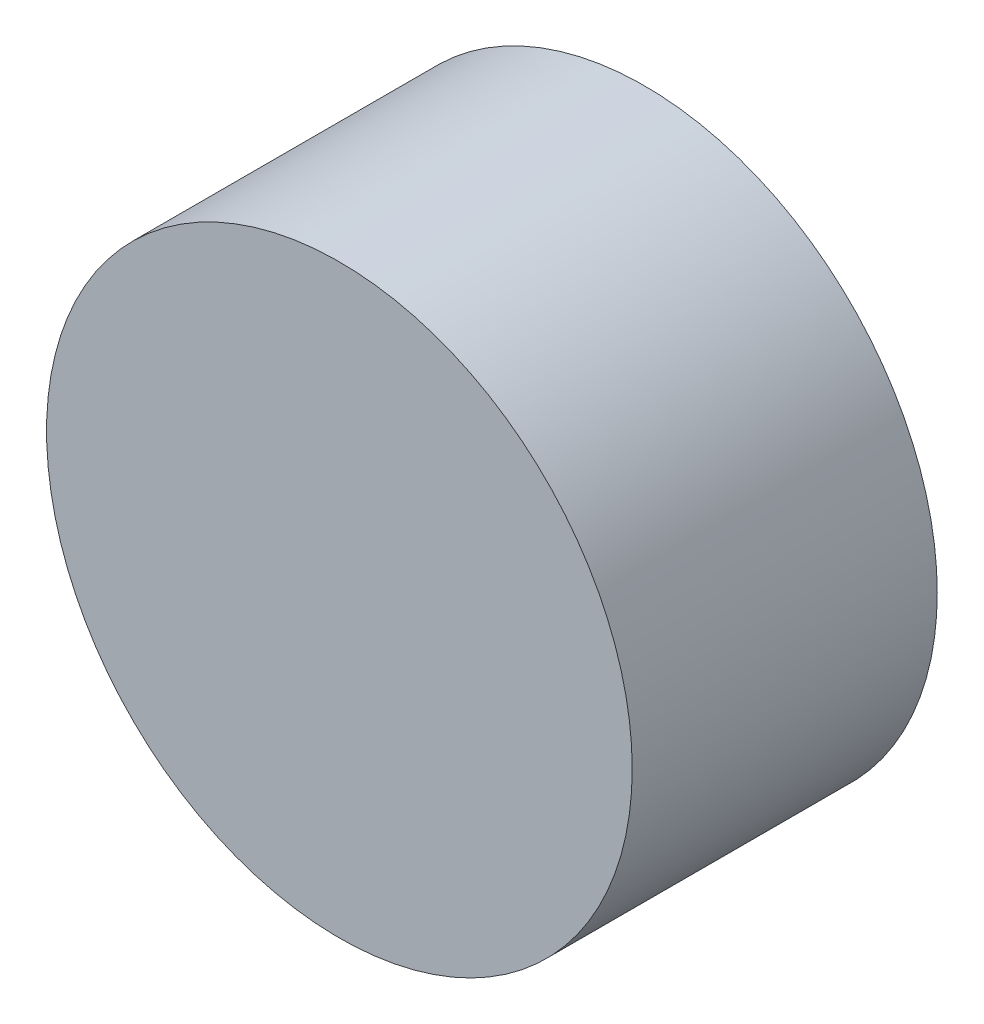
ISO-10303-21;
HEADER;
FILE_DESCRIPTION(('STEP AP214'),'2;1');
FILE_NAME('part.step','',(''),(''),'','','');
FILE_SCHEMA(('AUTOMOTIVE_DESIGN { 1 0 10303 214 1 1 1 1 }'));
ENDSEC;
DATA;
#1=APPLICATION_CONTEXT('core data for automotive mechanical design processes');
#2=APPLICATION_PROTOCOL_DEFINITION('international standard','automotive_design',2000,#1);
#3=PRODUCT_CONTEXT('',#1,'mechanical');
#4=PRODUCT('Part','Part','',(#3));
#5=PRODUCT_RELATED_PRODUCT_CATEGORY('part','',(#4));
#6=PRODUCT_DEFINITION_FORMATION('','',#4);
#7=PRODUCT_DEFINITION_CONTEXT('part definition',#1,'design');
#8=PRODUCT_DEFINITION('design','',#6,#7);
#9=PRODUCT_DEFINITION_SHAPE('','',#8);
#10=(LENGTH_UNIT() NAMED_UNIT(*) SI_UNIT(.MILLI.,.METRE.));
#11=(NAMED_UNIT(*) PLANE_ANGLE_UNIT() SI_UNIT($,.RADIAN.));
#12=(NAMED_UNIT(*) SI_UNIT($,.STERADIAN.) SOLID_ANGLE_UNIT());
#13=UNCERTAINTY_MEASURE_WITH_UNIT(LENGTH_MEASURE(1.E-05),#10,'distance_accuracy_value','');
#14=(GEOMETRIC_REPRESENTATION_CONTEXT(3) GLOBAL_UNCERTAINTY_ASSIGNED_CONTEXT((#13)) GLOBAL_UNIT_ASSIGNED_CONTEXT((#10,
#11,#12)) REPRESENTATION_CONTEXT('',''));
#15=CARTESIAN_POINT('',(0.,0.,0.));
#16=DIRECTION('',(0.,0.,1.));
#17=DIRECTION('',(1.,0.,0.));
#18=AXIS2_PLACEMENT_3D('',#15,#16,#17);
#19=CARTESIAN_POINT('',(0.,0.,25.));
#20=DIRECTION('',(0.,0.,-1.));
#21=DIRECTION('',(-1.,0.,0.));
#22=AXIS2_PLACEMENT_3D('',#19,#20,#21);
#23=CYLINDRICAL_SURFACE('',#22,24.);
#24=CARTESIAN_POINT('',(0.,0.,25.));
#25=DIRECTION('',(0.,0.,1.));
#26=DIRECTION('',(1.,0.,0.));
#27=AXIS2_PLACEMENT_3D('',#24,#25,#26);
#28=CIRCLE('',#27,24.);
#29=CARTESIAN_POINT('',(24.,0.,25.));
#30=VERTEX_POINT('',#29);
#31=EDGE_CURVE('E10',#30,#30,#28,.T.);
#32=ORIENTED_EDGE('',*,*,#31,.F.);
#33=EDGE_LOOP('',(#32));
#34=FACE_BOUND('',#33,.T.);
#35=CARTESIAN_POINT('',(0.,0.,0.));
#36=DIRECTION('',(0.,0.,1.));
#37=DIRECTION('',(1.,0.,0.));
#38=AXIS2_PLACEMENT_3D('',#35,#36,#37);
#39=CIRCLE('',#38,24.);
#40=CARTESIAN_POINT('',(24.,0.,0.));
#41=VERTEX_POINT('',#40);
#42=EDGE_CURVE('E40',#41,#41,#39,.T.);
#43=ORIENTED_EDGE('',*,*,#42,.T.);
#44=EDGE_LOOP('',(#43));
#45=FACE_BOUND('',#44,.T.);
#46=ADVANCED_FACE('F37',(#34,#45),#23,.T.);
#47=CARTESIAN_POINT('',(0.,0.,25.));
#48=DIRECTION('',(0.,0.,1.));
#49=DIRECTION('',(1.,0.,0.));
#50=AXIS2_PLACEMENT_3D('',#47,#48,#49);
#51=PLANE('',#50);
#52=ORIENTED_EDGE('',*,*,#31,.T.);
#53=EDGE_LOOP('',(#52));
#54=FACE_BOUND('',#53,.T.);
#55=ADVANCED_FACE('F52',(#54),#51,.T.);
#56=CARTESIAN_POINT('',(0.,0.,0.));
#57=DIRECTION('',(0.,0.,1.));
#58=DIRECTION('',(1.,0.,0.));
#59=AXIS2_PLACEMENT_3D('',#56,#57,#58);
#60=PLANE('',#59);
#61=ORIENTED_EDGE('',*,*,#42,.F.);
#62=EDGE_LOOP('',(#61));
#63=FACE_BOUND('',#62,.T.);
#64=ADVANCED_FACE('F50',(#63),#60,.F.);
#65=CLOSED_SHELL('',(#46,#55,#64));
#66=MANIFOLD_SOLID_BREP('B2',#65);
#67=ADVANCED_BREP_SHAPE_REPRESENTATION('',(#18,#66),#14);
#68=SHAPE_DEFINITION_REPRESENTATION(#9,#67);
ENDSEC;
END-ISO-10303-21;
